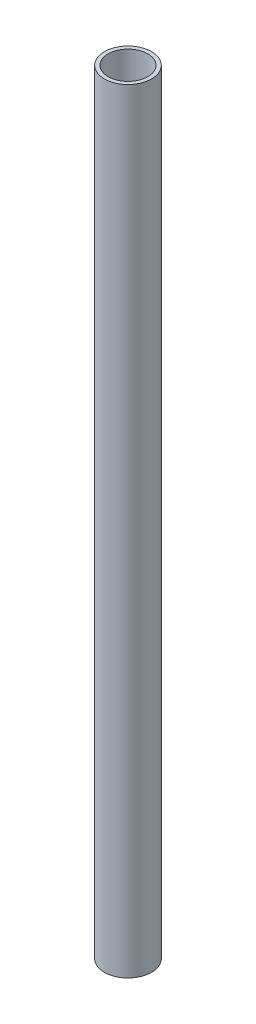
ISO-10303-21;
HEADER;
FILE_DESCRIPTION(('STEP AP214'),'2;1');
FILE_NAME('part.step','',(''),(''),'','','');
FILE_SCHEMA(('AUTOMOTIVE_DESIGN { 1 0 10303 214 1 1 1 1 }'));
ENDSEC;
DATA;
#1=APPLICATION_CONTEXT('core data for automotive mechanical design processes');
#2=APPLICATION_PROTOCOL_DEFINITION('international standard','automotive_design',2000,#1);
#3=PRODUCT_CONTEXT('',#1,'mechanical');
#4=PRODUCT('Part','Part','',(#3));
#5=PRODUCT_RELATED_PRODUCT_CATEGORY('part','',(#4));
#6=PRODUCT_DEFINITION_FORMATION('','',#4);
#7=PRODUCT_DEFINITION_CONTEXT('part definition',#1,'design');
#8=PRODUCT_DEFINITION('design','',#6,#7);
#9=PRODUCT_DEFINITION_SHAPE('','',#8);
#10=(LENGTH_UNIT() NAMED_UNIT(*) SI_UNIT(.MILLI.,.METRE.));
#11=(NAMED_UNIT(*) PLANE_ANGLE_UNIT() SI_UNIT($,.RADIAN.));
#12=(NAMED_UNIT(*) SI_UNIT($,.STERADIAN.) SOLID_ANGLE_UNIT());
#13=UNCERTAINTY_MEASURE_WITH_UNIT(LENGTH_MEASURE(1.E-05),#10,'distance_accuracy_value','');
#14=(GEOMETRIC_REPRESENTATION_CONTEXT(3) GLOBAL_UNCERTAINTY_ASSIGNED_CONTEXT((#13)) GLOBAL_UNIT_ASSIGNED_CONTEXT((#10,
#11,#12)) REPRESENTATION_CONTEXT('',''));
#15=CARTESIAN_POINT('',(0.,0.,0.));
#16=DIRECTION('',(0.,0.,1.));
#17=DIRECTION('',(1.,0.,0.));
#18=AXIS2_PLACEMENT_3D('',#15,#16,#17);
#19=CARTESIAN_POINT('',(0.,-205.,0.));
#20=DIRECTION('',(0.,1.,0.));
#21=DIRECTION('',(0.,0.,1.));
#22=AXIS2_PLACEMENT_3D('',#19,#20,#21);
#23=CYLINDRICAL_SURFACE('',#22,12.5);
#24=CARTESIAN_POINT('',(0.,-205.,0.));
#25=DIRECTION('',(0.,1.,0.));
#26=DIRECTION('',(0.,0.,1.));
#27=AXIS2_PLACEMENT_3D('',#24,#25,#26);
#28=CIRCLE('',#27,12.5);
#29=CARTESIAN_POINT('',(0.,-205.,12.5));
#30=VERTEX_POINT('',#29);
#31=EDGE_CURVE('E10',#30,#30,#28,.T.);
#32=CARTESIAN_POINT('',(0.,205.,0.));
#33=DIRECTION('',(0.,1.,0.));
#34=DIRECTION('',(0.,0.,1.));
#35=AXIS2_PLACEMENT_3D('',#32,#33,#34);
#36=CIRCLE('',#35,12.5);
#37=CARTESIAN_POINT('',(0.,205.,12.5));
#38=VERTEX_POINT('',#37);
#39=EDGE_CURVE('E40',#38,#38,#36,.T.);
#40=CARTESIAN_POINT('',(0.,-205.,12.5));
#41=CARTESIAN_POINT('',(0.,-200.729166666667,12.5));
#42=CARTESIAN_POINT('',(0.,-196.458333333333,12.5));
#43=CARTESIAN_POINT('',(0.,-187.916666666667,12.5));
#44=CARTESIAN_POINT('',(0.,-183.645833333333,12.5));
#45=CARTESIAN_POINT('',(0.,-175.104166666667,12.5));
#46=CARTESIAN_POINT('',(0.,-170.833333333333,12.5));
#47=CARTESIAN_POINT('',(0.,-162.291666666667,12.5));
#48=CARTESIAN_POINT('',(0.,-158.020833333333,12.5));
#49=CARTESIAN_POINT('',(0.,-149.479166666667,12.5));
#50=CARTESIAN_POINT('',(0.,-145.208333333333,12.5));
#51=CARTESIAN_POINT('',(0.,-136.666666666667,12.5));
#52=CARTESIAN_POINT('',(0.,-132.395833333333,12.5));
#53=CARTESIAN_POINT('',(0.,-123.854166666667,12.5));
#54=CARTESIAN_POINT('',(0.,-119.583333333333,12.5));
#55=CARTESIAN_POINT('',(0.,-111.041666666667,12.5));
#56=CARTESIAN_POINT('',(0.,-106.770833333333,12.5));
#57=CARTESIAN_POINT('',(0.,-98.2291666666667,12.5));
#58=CARTESIAN_POINT('',(0.,-93.9583333333333,12.5));
#59=CARTESIAN_POINT('',(0.,-85.4166666666667,12.5));
#60=CARTESIAN_POINT('',(0.,-81.1458333333333,12.5));
#61=CARTESIAN_POINT('',(0.,-72.6041666666667,12.5));
#62=CARTESIAN_POINT('',(0.,-68.3333333333333,12.5));
#63=CARTESIAN_POINT('',(0.,-59.7916666666667,12.5));
#64=CARTESIAN_POINT('',(0.,-55.5208333333333,12.5));
#65=CARTESIAN_POINT('',(0.,-46.9791666666667,12.5));
#66=CARTESIAN_POINT('',(0.,-42.7083333333333,12.5));
#67=CARTESIAN_POINT('',(0.,-34.1666666666667,12.5));
#68=CARTESIAN_POINT('',(0.,-29.8958333333333,12.5));
#69=CARTESIAN_POINT('',(0.,-21.3541666666667,12.5));
#70=CARTESIAN_POINT('',(0.,-17.0833333333333,12.5));
#71=CARTESIAN_POINT('',(0.,-8.54166666666667,12.5));
#72=CARTESIAN_POINT('',(0.,-4.27083333333333,12.5));
#73=CARTESIAN_POINT('',(0.,4.27083333333333,12.5));
#74=CARTESIAN_POINT('',(0.,8.54166666666667,12.5));
#75=CARTESIAN_POINT('',(0.,17.0833333333333,12.5));
#76=CARTESIAN_POINT('',(0.,21.3541666666667,12.5));
#77=CARTESIAN_POINT('',(0.,29.8958333333333,12.5));
#78=CARTESIAN_POINT('',(0.,34.1666666666667,12.5));
#79=CARTESIAN_POINT('',(0.,42.7083333333333,12.5));
#80=CARTESIAN_POINT('',(0.,46.9791666666667,12.5));
#81=CARTESIAN_POINT('',(0.,55.5208333333333,12.5));
#82=CARTESIAN_POINT('',(0.,59.7916666666667,12.5));
#83=CARTESIAN_POINT('',(0.,68.3333333333333,12.5));
#84=CARTESIAN_POINT('',(0.,72.6041666666667,12.5));
#85=CARTESIAN_POINT('',(0.,81.1458333333333,12.5));
#86=CARTESIAN_POINT('',(0.,85.4166666666667,12.5));
#87=CARTESIAN_POINT('',(0.,93.9583333333333,12.5));
#88=CARTESIAN_POINT('',(0.,98.2291666666666,12.5));
#89=CARTESIAN_POINT('',(0.,106.770833333333,12.5));
#90=CARTESIAN_POINT('',(0.,111.041666666667,12.5));
#91=CARTESIAN_POINT('',(0.,119.583333333333,12.5));
#92=CARTESIAN_POINT('',(0.,123.854166666667,12.5));
#93=CARTESIAN_POINT('',(0.,132.395833333333,12.5));
#94=CARTESIAN_POINT('',(0.,136.666666666667,12.5));
#95=CARTESIAN_POINT('',(0.,145.208333333333,12.5));
#96=CARTESIAN_POINT('',(0.,149.479166666667,12.5));
#97=CARTESIAN_POINT('',(0.,158.020833333333,12.5));
#98=CARTESIAN_POINT('',(0.,162.291666666667,12.5));
#99=CARTESIAN_POINT('',(0.,170.833333333333,12.5));
#100=CARTESIAN_POINT('',(0.,175.104166666667,12.5));
#101=CARTESIAN_POINT('',(0.,183.645833333333,12.5));
#102=CARTESIAN_POINT('',(0.,187.916666666667,12.5));
#103=CARTESIAN_POINT('',(0.,196.458333333333,12.5));
#104=CARTESIAN_POINT('',(0.,200.729166666667,12.5));
#105=CARTESIAN_POINT('',(0.,205.,12.5));
#106=B_SPLINE_CURVE_WITH_KNOTS('',3,(#40,#41,#42,#43,#44,#45,#46,#47,#48,#49,#50,#51,#52,#53,
#54,#55,#56,#57,#58,#59,#60,#61,#62,#63,#64,#65,#66,#67,#68,#69,#70,#71,#72,#73,#74,#75,#76,#77,
#78,#79,#80,#81,#82,#83,#84,#85,#86,#87,#88,#89,#90,#91,#92,#93,#94,#95,#96,#97,#98,#99,#100,
#101,#102,#103,#104,#105),.UNSPECIFIED.,.F.,.F.,(4,2,2,2,2,2,2,2,2,2,2,2,2,2,2,2,2,2,2,2,2,2,2,
2,2,2,2,2,2,2,2,2,4),(0.,12.8125,25.625,38.4375,51.25,64.0625,76.875,89.6875,102.5,115.3125,
128.125,140.9375,153.75,166.5625,179.375,192.1875,205.,217.8125,230.625,243.4375,256.25,
269.0625,281.875,294.6875,307.5,320.3125,333.125,345.9375,358.75,371.5625,384.375,397.1875,
410.),.UNSPECIFIED.);
#107=EDGE_CURVE('BSEAM30',#30,#38,#106,.T.);
#108=ORIENTED_EDGE('',*,*,#31,.T.);
#109=ORIENTED_EDGE('',*,*,#39,.F.);
#110=ORIENTED_EDGE('',*,*,#107,.T.);
#111=ORIENTED_EDGE('',*,*,#107,.F.);
#112=EDGE_LOOP('',(#108,#110,#109,#111));
#113=FACE_BOUND('',#112,.T.);
#114=ADVANCED_FACE('F30',(#113),#23,.T.);
#115=CARTESIAN_POINT('',(0.,-205.,0.));
#116=DIRECTION('',(0.,1.,0.));
#117=DIRECTION('',(0.,0.,1.));
#118=AXIS2_PLACEMENT_3D('',#115,#116,#117);
#119=PLANE('',#118);
#120=CARTESIAN_POINT('',(0.,-205.,0.));
#121=DIRECTION('',(0.,1.,0.));
#122=DIRECTION('',(0.,0.,1.));
#123=AXIS2_PLACEMENT_3D('',#120,#121,#122);
#124=CIRCLE('',#123,10.5);
#125=CARTESIAN_POINT('',(0.,-205.,10.5));
#126=VERTEX_POINT('',#125);
#127=EDGE_CURVE('E36',#126,#126,#124,.T.);
#128=ORIENTED_EDGE('',*,*,#127,.T.);
#129=EDGE_LOOP('',(#128));
#130=FACE_BOUND('',#129,.T.);
#131=ORIENTED_EDGE('',*,*,#31,.F.);
#132=EDGE_LOOP('',(#131));
#133=FACE_BOUND('',#132,.T.);
#134=ADVANCED_FACE('F59',(#130,#133),#119,.F.);
#135=CARTESIAN_POINT('',(0.,-205.,0.));
#136=DIRECTION('',(0.,1.,0.));
#137=DIRECTION('',(0.,0.,1.));
#138=AXIS2_PLACEMENT_3D('',#135,#136,#137);
#139=CYLINDRICAL_SURFACE('',#138,10.5);
#140=CARTESIAN_POINT('',(0.,205.,0.));
#141=DIRECTION('',(0.,1.,0.));
#142=DIRECTION('',(0.,0.,1.));
#143=AXIS2_PLACEMENT_3D('',#140,#141,#142);
#144=CIRCLE('',#143,10.5);
#145=CARTESIAN_POINT('',(0.,205.,10.5));
#146=VERTEX_POINT('',#145);
#147=EDGE_CURVE('E44',#146,#146,#144,.T.);
#148=CARTESIAN_POINT('',(0.,-205.,10.5));
#149=CARTESIAN_POINT('',(0.,-200.729166666667,10.5));
#150=CARTESIAN_POINT('',(0.,-196.458333333333,10.5));
#151=CARTESIAN_POINT('',(0.,-187.916666666667,10.5));
#152=CARTESIAN_POINT('',(0.,-183.645833333333,10.5));
#153=CARTESIAN_POINT('',(0.,-175.104166666667,10.5));
#154=CARTESIAN_POINT('',(0.,-170.833333333333,10.5));
#155=CARTESIAN_POINT('',(0.,-162.291666666667,10.5));
#156=CARTESIAN_POINT('',(0.,-158.020833333333,10.5));
#157=CARTESIAN_POINT('',(0.,-149.479166666667,10.5));
#158=CARTESIAN_POINT('',(0.,-145.208333333333,10.5));
#159=CARTESIAN_POINT('',(0.,-136.666666666667,10.5));
#160=CARTESIAN_POINT('',(0.,-132.395833333333,10.5));
#161=CARTESIAN_POINT('',(0.,-123.854166666667,10.5));
#162=CARTESIAN_POINT('',(0.,-119.583333333333,10.5));
#163=CARTESIAN_POINT('',(0.,-111.041666666667,10.5));
#164=CARTESIAN_POINT('',(0.,-106.770833333333,10.5));
#165=CARTESIAN_POINT('',(0.,-98.2291666666667,10.5));
#166=CARTESIAN_POINT('',(0.,-93.9583333333333,10.5));
#167=CARTESIAN_POINT('',(0.,-85.4166666666667,10.5));
#168=CARTESIAN_POINT('',(0.,-81.1458333333333,10.5));
#169=CARTESIAN_POINT('',(0.,-72.6041666666667,10.5));
#170=CARTESIAN_POINT('',(0.,-68.3333333333334,10.5));
#171=CARTESIAN_POINT('',(0.,-59.7916666666667,10.5));
#172=CARTESIAN_POINT('',(0.,-55.5208333333334,10.5));
#173=CARTESIAN_POINT('',(0.,-46.9791666666667,10.5));
#174=CARTESIAN_POINT('',(0.,-42.7083333333334,10.5));
#175=CARTESIAN_POINT('',(0.,-34.1666666666667,10.5));
#176=CARTESIAN_POINT('',(0.,-29.8958333333334,10.5));
#177=CARTESIAN_POINT('',(0.,-21.3541666666667,10.5));
#178=CARTESIAN_POINT('',(0.,-17.0833333333334,10.5));
#179=CARTESIAN_POINT('',(0.,-8.5416666666667,10.5));
#180=CARTESIAN_POINT('',(0.,-4.27083333333336,10.5));
#181=CARTESIAN_POINT('',(0.,4.27083333333331,10.5));
#182=CARTESIAN_POINT('',(0.,8.54166666666664,10.5));
#183=CARTESIAN_POINT('',(0.,17.0833333333333,10.5));
#184=CARTESIAN_POINT('',(0.,21.3541666666666,10.5));
#185=CARTESIAN_POINT('',(0.,29.8958333333333,10.5));
#186=CARTESIAN_POINT('',(0.,34.1666666666667,10.5));
#187=CARTESIAN_POINT('',(0.,42.7083333333333,10.5));
#188=CARTESIAN_POINT('',(0.,46.9791666666667,10.5));
#189=CARTESIAN_POINT('',(0.,55.5208333333333,10.5));
#190=CARTESIAN_POINT('',(0.,59.7916666666667,10.5));
#191=CARTESIAN_POINT('',(0.,68.3333333333333,10.5));
#192=CARTESIAN_POINT('',(0.,72.6041666666667,10.5));
#193=CARTESIAN_POINT('',(0.,81.1458333333333,10.5));
#194=CARTESIAN_POINT('',(0.,85.4166666666667,10.5));
#195=CARTESIAN_POINT('',(0.,93.9583333333333,10.5));
#196=CARTESIAN_POINT('',(0.,98.2291666666666,10.5));
#197=CARTESIAN_POINT('',(0.,106.770833333333,10.5));
#198=CARTESIAN_POINT('',(0.,111.041666666667,10.5));
#199=CARTESIAN_POINT('',(0.,119.583333333333,10.5));
#200=CARTESIAN_POINT('',(0.,123.854166666667,10.5));
#201=CARTESIAN_POINT('',(0.,132.395833333333,10.5));
#202=CARTESIAN_POINT('',(0.,136.666666666667,10.5));
#203=CARTESIAN_POINT('',(0.,145.208333333333,10.5));
#204=CARTESIAN_POINT('',(0.,149.479166666667,10.5));
#205=CARTESIAN_POINT('',(0.,158.020833333333,10.5));
#206=CARTESIAN_POINT('',(0.,162.291666666667,10.5));
#207=CARTESIAN_POINT('',(0.,170.833333333333,10.5));
#208=CARTESIAN_POINT('',(0.,175.104166666667,10.5));
#209=CARTESIAN_POINT('',(0.,183.645833333333,10.5));
#210=CARTESIAN_POINT('',(0.,187.916666666667,10.5));
#211=CARTESIAN_POINT('',(0.,196.458333333333,10.5));
#212=CARTESIAN_POINT('',(0.,200.729166666667,10.5));
#213=CARTESIAN_POINT('',(0.,205.,10.5));
#214=B_SPLINE_CURVE_WITH_KNOTS('',3,(#148,#149,#150,#151,#152,#153,#154,#155,#156,#157,#158,
#159,#160,#161,#162,#163,#164,#165,#166,#167,#168,#169,#170,#171,#172,#173,#174,#175,#176,#177,
#178,#179,#180,#181,#182,#183,#184,#185,#186,#187,#188,#189,#190,#191,#192,#193,#194,#195,#196,
#197,#198,#199,#200,#201,#202,#203,#204,#205,#206,#207,#208,#209,#210,#211,#212,#213),
.UNSPECIFIED.,.F.,.F.,(4,2,2,2,2,2,2,2,2,2,2,2,2,2,2,2,2,2,2,2,2,2,2,2,2,2,2,2,2,2,2,2,4),(0.,
12.8125,25.625,38.4375,51.25,64.0625,76.875,89.6875,102.5,115.3125,128.125,140.9375,153.75,
166.5625,179.375,192.1875,205.,217.8125,230.625,243.4375,256.25,269.0625,281.875,294.6875,307.5,
320.3125,333.125,345.9375,358.75,371.5625,384.375,397.1875,410.),.UNSPECIFIED.);
#215=EDGE_CURVE('BSEAM50',#126,#146,#214,.T.);
#216=ORIENTED_EDGE('',*,*,#127,.F.);
#217=ORIENTED_EDGE('',*,*,#147,.T.);
#218=ORIENTED_EDGE('',*,*,#215,.T.);
#219=ORIENTED_EDGE('',*,*,#215,.F.);
#220=EDGE_LOOP('',(#216,#218,#217,#219));
#221=FACE_BOUND('',#220,.T.);
#222=ADVANCED_FACE('F50',(#221),#139,.F.);
#223=CARTESIAN_POINT('',(0.,205.,0.));
#224=DIRECTION('',(0.,1.,0.));
#225=DIRECTION('',(0.,0.,1.));
#226=AXIS2_PLACEMENT_3D('',#223,#224,#225);
#227=PLANE('',#226);
#228=ORIENTED_EDGE('',*,*,#39,.T.);
#229=EDGE_LOOP('',(#228));
#230=FACE_BOUND('',#229,.T.);
#231=ORIENTED_EDGE('',*,*,#147,.F.);
#232=EDGE_LOOP('',(#231));
#233=FACE_BOUND('',#232,.T.);
#234=ADVANCED_FACE('F52',(#230,#233),#227,.T.);
#235=CLOSED_SHELL('',(#114,#134,#222,#234));
#236=MANIFOLD_SOLID_BREP('B2',#235);
#237=ADVANCED_BREP_SHAPE_REPRESENTATION('',(#18,#236),#14);
#238=SHAPE_DEFINITION_REPRESENTATION(#9,#237);
ENDSEC;
END-ISO-10303-21;
